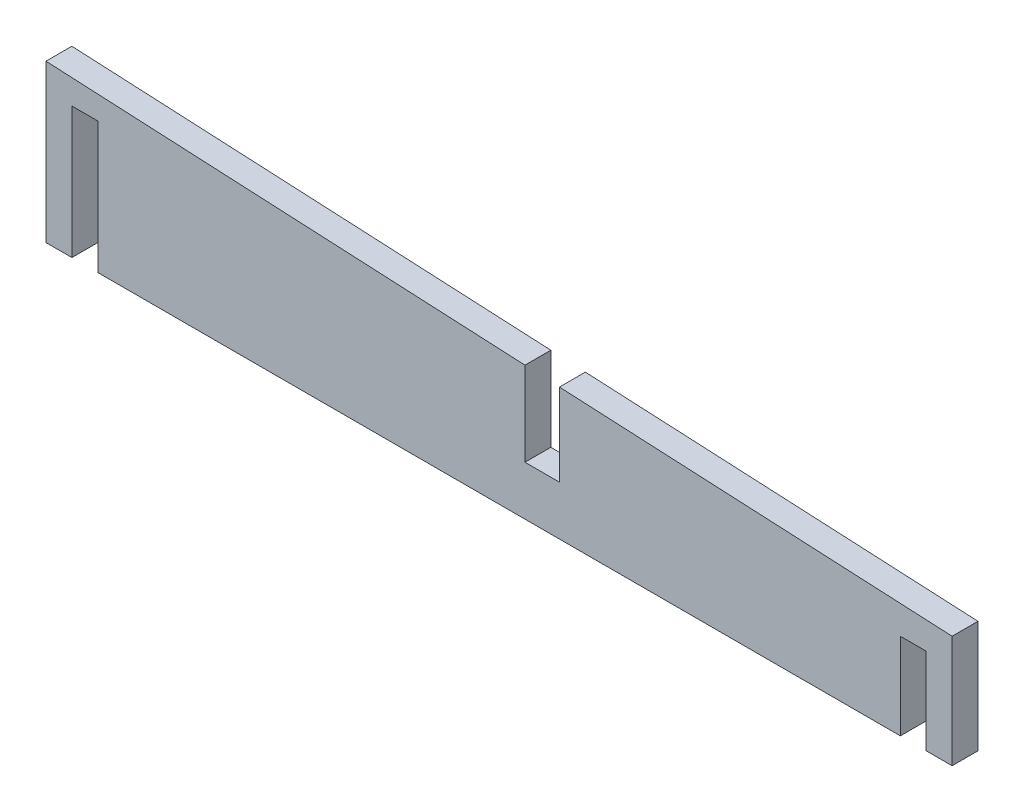
ISO-10303-21;
HEADER;
FILE_DESCRIPTION(('STEP AP214'),'2;1');
FILE_NAME('part.step','',(''),(''),'','','');
FILE_SCHEMA(('AUTOMOTIVE_DESIGN { 1 0 10303 214 1 1 1 1 }'));
ENDSEC;
DATA;
#1=APPLICATION_CONTEXT('core data for automotive mechanical design processes');
#2=APPLICATION_PROTOCOL_DEFINITION('international standard','automotive_design',2000,#1);
#3=PRODUCT_CONTEXT('',#1,'mechanical');
#4=PRODUCT('Part','Part','',(#3));
#5=PRODUCT_RELATED_PRODUCT_CATEGORY('part','',(#4));
#6=PRODUCT_DEFINITION_FORMATION('','',#4);
#7=PRODUCT_DEFINITION_CONTEXT('part definition',#1,'design');
#8=PRODUCT_DEFINITION('design','',#6,#7);
#9=PRODUCT_DEFINITION_SHAPE('','',#8);
#10=(LENGTH_UNIT() NAMED_UNIT(*) SI_UNIT(.MILLI.,.METRE.));
#11=(NAMED_UNIT(*) PLANE_ANGLE_UNIT() SI_UNIT($,.RADIAN.));
#12=(NAMED_UNIT(*) SI_UNIT($,.STERADIAN.) SOLID_ANGLE_UNIT());
#13=UNCERTAINTY_MEASURE_WITH_UNIT(LENGTH_MEASURE(1.E-05),#10,'distance_accuracy_value','');
#14=(GEOMETRIC_REPRESENTATION_CONTEXT(3) GLOBAL_UNCERTAINTY_ASSIGNED_CONTEXT((#13)) GLOBAL_UNIT_ASSIGNED_CONTEXT((#10,
#11,#12)) REPRESENTATION_CONTEXT('',''));
#15=CARTESIAN_POINT('',(0.,0.,0.));
#16=DIRECTION('',(0.,0.,1.));
#17=DIRECTION('',(1.,0.,0.));
#18=AXIS2_PLACEMENT_3D('',#15,#16,#17);
#19=CARTESIAN_POINT('',(99.,0.,3.));
#20=DIRECTION('',(1.,0.,0.));
#21=DIRECTION('',(0.,0.,-1.));
#22=AXIS2_PLACEMENT_3D('',#19,#20,#21);
#23=PLANE('',#22);
#24=DIRECTION('',(0.,-1.,0.));
#25=VECTOR('',#24,1.);
#26=CARTESIAN_POINT('',(99.,0.,0.));
#27=LINE('',#26,#25);
#28=CARTESIAN_POINT('',(99.,9.78991693602012,0.));
#29=VERTEX_POINT('',#28);
#30=CARTESIAN_POINT('',(99.,-0.210083063979876,0.));
#31=VERTEX_POINT('',#30);
#32=EDGE_CURVE('E185',#29,#31,#27,.T.);
#33=ORIENTED_EDGE('',*,*,#32,.T.);
#34=DIRECTION('',(0.,0.,-1.));
#35=VECTOR('',#34,1.);
#36=CARTESIAN_POINT('',(99.,-0.210083063979876,3.));
#37=LINE('',#36,#35);
#38=CARTESIAN_POINT('',(99.,-0.210083063979876,3.));
#39=VERTEX_POINT('',#38);
#40=EDGE_CURVE('E11',#39,#31,#37,.T.);
#41=ORIENTED_EDGE('',*,*,#40,.F.);
#42=DIRECTION('',(0.,-1.,0.));
#43=VECTOR('',#42,1.);
#44=CARTESIAN_POINT('',(99.,0.,3.));
#45=LINE('',#44,#43);
#46=CARTESIAN_POINT('',(99.,9.78991693602012,3.));
#47=VERTEX_POINT('',#46);
#48=EDGE_CURVE('E225',#47,#39,#45,.T.);
#49=ORIENTED_EDGE('',*,*,#48,.F.);
#50=DIRECTION('',(0.,0.,-1.));
#51=VECTOR('',#50,1.);
#52=CARTESIAN_POINT('',(99.,9.78991693602012,3.));
#53=LINE('',#52,#51);
#54=EDGE_CURVE('E57',#47,#29,#53,.T.);
#55=ORIENTED_EDGE('',*,*,#54,.T.);
#56=EDGE_LOOP('',(#33,#41,#49,#55));
#57=FACE_BOUND('',#56,.T.);
#58=ADVANCED_FACE('F41',(#57),#23,.F.);
#59=CARTESIAN_POINT('',(0.,-0.210083063979876,3.));
#60=DIRECTION('',(0.,1.,0.));
#61=DIRECTION('',(0.,0.,1.));
#62=AXIS2_PLACEMENT_3D('',#59,#60,#61);
#63=PLANE('',#62);
#64=DIRECTION('',(1.,0.,0.));
#65=VECTOR('',#64,1.);
#66=CARTESIAN_POINT('',(0.,-0.210083063979876,0.));
#67=LINE('',#66,#65);
#68=CARTESIAN_POINT('',(102.,-0.210083063979876,0.));
#69=VERTEX_POINT('',#68);
#70=EDGE_CURVE('E187',#31,#69,#67,.T.);
#71=ORIENTED_EDGE('',*,*,#70,.T.);
#72=DIRECTION('',(0.,0.,-1.));
#73=VECTOR('',#72,1.);
#74=CARTESIAN_POINT('',(102.,-0.210083063979876,3.));
#75=LINE('',#74,#73);
#76=CARTESIAN_POINT('',(102.,-0.210083063979876,3.));
#77=VERTEX_POINT('',#76);
#78=EDGE_CURVE('E49',#77,#69,#75,.T.);
#79=ORIENTED_EDGE('',*,*,#78,.F.);
#80=DIRECTION('',(1.,0.,0.));
#81=VECTOR('',#80,1.);
#82=CARTESIAN_POINT('',(0.,-0.210083063979876,3.));
#83=LINE('',#82,#81);
#84=EDGE_CURVE('E119',#39,#77,#83,.T.);
#85=ORIENTED_EDGE('',*,*,#84,.F.);
#86=ORIENTED_EDGE('',*,*,#40,.T.);
#87=EDGE_LOOP('',(#71,#79,#85,#86));
#88=FACE_BOUND('',#87,.T.);
#89=ADVANCED_FACE('F307',(#88),#63,.F.);
#90=CARTESIAN_POINT('',(102.,0.,3.));
#91=DIRECTION('',(-1.,0.,0.));
#92=DIRECTION('',(0.,0.,1.));
#93=AXIS2_PLACEMENT_3D('',#90,#91,#92);
#94=PLANE('',#93);
#95=DIRECTION('',(0.,1.,0.));
#96=VECTOR('',#95,1.);
#97=CARTESIAN_POINT('',(102.,0.,0.));
#98=LINE('',#97,#96);
#99=CARTESIAN_POINT('',(102.,12.7899169360201,0.));
#100=VERTEX_POINT('',#99);
#101=EDGE_CURVE('E189',#69,#100,#98,.T.);
#102=ORIENTED_EDGE('',*,*,#101,.T.);
#103=DIRECTION('',(0.,0.,-1.));
#104=VECTOR('',#103,1.);
#105=CARTESIAN_POINT('',(102.,12.7899169360201,3.));
#106=LINE('',#105,#104);
#107=CARTESIAN_POINT('',(102.,12.7899169360201,3.));
#108=VERTEX_POINT('',#107);
#109=EDGE_CURVE('E249',#108,#100,#106,.T.);
#110=ORIENTED_EDGE('',*,*,#109,.F.);
#111=DIRECTION('',(0.,1.,0.));
#112=VECTOR('',#111,1.);
#113=CARTESIAN_POINT('',(102.,0.,3.));
#114=LINE('',#113,#112);
#115=EDGE_CURVE('E257',#77,#108,#114,.T.);
#116=ORIENTED_EDGE('',*,*,#115,.F.);
#117=ORIENTED_EDGE('',*,*,#78,.T.);
#118=EDGE_LOOP('',(#102,#110,#116,#117));
#119=FACE_BOUND('',#118,.T.);
#120=ADVANCED_FACE('F255',(#119),#94,.F.);
#121=CARTESIAN_POINT('',(0.883595186705893,17.8072966332418,3.));
#122=DIRECTION('',(-0.0495588660664779,-0.998771204427823,0.));
#123=DIRECTION('',(0.998771204427824,-0.0495588660664779,0.));
#124=AXIS2_PLACEMENT_3D('',#121,#122,#123);
#125=PLANE('',#124);
#126=DIRECTION('',(-0.998771204427823,0.0495588660664779,0.));
#127=VECTOR('',#126,1.);
#128=CARTESIAN_POINT('',(0.883595186705893,17.8072966332418,0.));
#129=LINE('',#128,#127);
#130=CARTESIAN_POINT('',(56.5,15.0476195970781,0.));
#131=VERTEX_POINT('',#130);
#132=EDGE_CURVE('E191',#100,#131,#129,.T.);
#133=ORIENTED_EDGE('',*,*,#132,.T.);
#134=DIRECTION('',(0.,0.,-1.));
#135=VECTOR('',#134,1.);
#136=CARTESIAN_POINT('',(56.5,15.0476195970781,3.));
#137=LINE('',#136,#135);
#138=CARTESIAN_POINT('',(56.5,15.0476195970781,3.));
#139=VERTEX_POINT('',#138);
#140=EDGE_CURVE('E247',#139,#131,#137,.T.);
#141=ORIENTED_EDGE('',*,*,#140,.F.);
#142=DIRECTION('',(-0.998771204427823,0.0495588660664779,0.));
#143=VECTOR('',#142,1.);
#144=CARTESIAN_POINT('',(0.883595186705893,17.8072966332418,3.));
#145=LINE('',#144,#143);
#146=EDGE_CURVE('E267',#108,#139,#145,.T.);
#147=ORIENTED_EDGE('',*,*,#146,.F.);
#148=ORIENTED_EDGE('',*,*,#109,.T.);
#149=EDGE_LOOP('',(#133,#141,#147,#148));
#150=FACE_BOUND('',#149,.T.);
#151=ADVANCED_FACE('F264',(#150),#125,.F.);
#152=CARTESIAN_POINT('',(56.5,0.,3.));
#153=DIRECTION('',(-1.,0.,0.));
#154=DIRECTION('',(0.,0.,1.));
#155=AXIS2_PLACEMENT_3D('',#152,#153,#154);
#156=PLANE('',#155);
#157=DIRECTION('',(0.,1.,0.));
#158=VECTOR('',#157,1.);
#159=CARTESIAN_POINT('',(56.5,0.,0.));
#160=LINE('',#159,#158);
#161=CARTESIAN_POINT('',(56.5,5.5,0.));
#162=VERTEX_POINT('',#161);
#163=EDGE_CURVE('E194',#162,#131,#160,.T.);
#164=ORIENTED_EDGE('',*,*,#163,.F.);
#165=DIRECTION('',(0.,0.,-1.));
#166=VECTOR('',#165,1.);
#167=CARTESIAN_POINT('',(56.5,5.5,3.));
#168=LINE('',#167,#166);
#169=CARTESIAN_POINT('',(56.5,5.5,3.));
#170=VERTEX_POINT('',#169);
#171=EDGE_CURVE('E245',#170,#162,#168,.T.);
#172=ORIENTED_EDGE('',*,*,#171,.F.);
#173=DIRECTION('',(0.,1.,0.));
#174=VECTOR('',#173,1.);
#175=CARTESIAN_POINT('',(56.5,0.,3.));
#176=LINE('',#175,#174);
#177=EDGE_CURVE('E269',#170,#139,#176,.T.);
#178=ORIENTED_EDGE('',*,*,#177,.T.);
#179=ORIENTED_EDGE('',*,*,#140,.T.);
#180=EDGE_LOOP('',(#164,#172,#178,#179));
#181=FACE_BOUND('',#180,.T.);
#182=ADVANCED_FACE('F320',(#181),#156,.T.);
#183=CARTESIAN_POINT('',(0.,5.49999999999999,3.));
#184=DIRECTION('',(0.,1.,0.));
#185=DIRECTION('',(-1.,0.,0.));
#186=AXIS2_PLACEMENT_3D('',#183,#184,#185);
#187=PLANE('',#186);
#188=DIRECTION('',(1.,0.,0.));
#189=VECTOR('',#188,1.);
#190=CARTESIAN_POINT('',(0.,5.49999999999999,0.));
#191=LINE('',#190,#189);
#192=CARTESIAN_POINT('',(52.5,5.5,0.));
#193=VERTEX_POINT('',#192);
#194=EDGE_CURVE('E197',#193,#162,#191,.T.);
#195=ORIENTED_EDGE('',*,*,#194,.F.);
#196=DIRECTION('',(0.,0.,-1.));
#197=VECTOR('',#196,1.);
#198=CARTESIAN_POINT('',(52.5,5.5,3.));
#199=LINE('',#198,#197);
#200=CARTESIAN_POINT('',(52.5,5.5,3.));
#201=VERTEX_POINT('',#200);
#202=EDGE_CURVE('E243',#201,#193,#199,.T.);
#203=ORIENTED_EDGE('',*,*,#202,.F.);
#204=DIRECTION('',(1.,0.,0.));
#205=VECTOR('',#204,1.);
#206=CARTESIAN_POINT('',(0.,5.49999999999999,3.));
#207=LINE('',#206,#205);
#208=EDGE_CURVE('E271',#201,#170,#207,.T.);
#209=ORIENTED_EDGE('',*,*,#208,.T.);
#210=ORIENTED_EDGE('',*,*,#171,.T.);
#211=EDGE_LOOP('',(#195,#203,#209,#210));
#212=FACE_BOUND('',#211,.T.);
#213=ADVANCED_FACE('F323',(#212),#187,.T.);
#214=CARTESIAN_POINT('',(52.5,0.,3.));
#215=DIRECTION('',(1.,0.,0.));
#216=DIRECTION('',(0.,0.,-1.));
#217=AXIS2_PLACEMENT_3D('',#214,#215,#216);
#218=PLANE('',#217);
#219=DIRECTION('',(0.,-1.,0.));
#220=VECTOR('',#219,1.);
#221=CARTESIAN_POINT('',(52.5,0.,0.));
#222=LINE('',#221,#220);
#223=CARTESIAN_POINT('',(52.5,15.2460989518963,0.));
#224=VERTEX_POINT('',#223);
#225=EDGE_CURVE('E200',#224,#193,#222,.T.);
#226=ORIENTED_EDGE('',*,*,#225,.F.);
#227=DIRECTION('',(0.,0.,-1.));
#228=VECTOR('',#227,1.);
#229=CARTESIAN_POINT('',(52.5,15.2460989518963,3.));
#230=LINE('',#229,#228);
#231=CARTESIAN_POINT('',(52.5,15.2460989518963,3.));
#232=VERTEX_POINT('',#231);
#233=EDGE_CURVE('E241',#232,#224,#230,.T.);
#234=ORIENTED_EDGE('',*,*,#233,.F.);
#235=DIRECTION('',(0.,-1.,0.));
#236=VECTOR('',#235,1.);
#237=CARTESIAN_POINT('',(52.5,0.,3.));
#238=LINE('',#237,#236);
#239=EDGE_CURVE('E278',#232,#201,#238,.T.);
#240=ORIENTED_EDGE('',*,*,#239,.T.);
#241=ORIENTED_EDGE('',*,*,#202,.T.);
#242=EDGE_LOOP('',(#226,#234,#240,#241));
#243=FACE_BOUND('',#242,.T.);
#244=ADVANCED_FACE('F327',(#243),#218,.T.);
#245=CARTESIAN_POINT('',(0.883595186705896,17.8072966332418,3.));
#246=DIRECTION('',(-0.049558866066478,-0.998771204427823,0.));
#247=DIRECTION('',(0.998771204427824,-0.049558866066478,0.));
#248=AXIS2_PLACEMENT_3D('',#245,#246,#247);
#249=PLANE('',#248);
#250=DIRECTION('',(-0.998771204427823,0.049558866066478,0.));
#251=VECTOR('',#250,1.);
#252=CARTESIAN_POINT('',(0.883595186705896,17.8072966332418,0.));
#253=LINE('',#252,#251);
#254=CARTESIAN_POINT('',(-3.,18.,0.));
#255=VERTEX_POINT('',#254);
#256=EDGE_CURVE('E203',#224,#255,#253,.T.);
#257=ORIENTED_EDGE('',*,*,#256,.T.);
#258=DIRECTION('',(0.,0.,-1.));
#259=VECTOR('',#258,1.);
#260=CARTESIAN_POINT('',(-3.,18.,3.));
#261=LINE('',#260,#259);
#262=CARTESIAN_POINT('',(-3.,18.,3.));
#263=VERTEX_POINT('',#262);
#264=EDGE_CURVE('E238',#263,#255,#261,.T.);
#265=ORIENTED_EDGE('',*,*,#264,.F.);
#266=DIRECTION('',(-0.998771204427823,0.049558866066478,0.));
#267=VECTOR('',#266,1.);
#268=CARTESIAN_POINT('',(0.883595186705896,17.8072966332418,3.));
#269=LINE('',#268,#267);
#270=EDGE_CURVE('E281',#232,#263,#269,.T.);
#271=ORIENTED_EDGE('',*,*,#270,.F.);
#272=ORIENTED_EDGE('',*,*,#233,.T.);
#273=EDGE_LOOP('',(#257,#265,#271,#272));
#274=FACE_BOUND('',#273,.T.);
#275=ADVANCED_FACE('F331',(#274),#249,.F.);
#276=CARTESIAN_POINT('',(-3.,0.,3.));
#277=DIRECTION('',(1.,0.,0.));
#278=DIRECTION('',(0.,0.,-1.));
#279=AXIS2_PLACEMENT_3D('',#276,#277,#278);
#280=PLANE('',#279);
#281=DIRECTION('',(0.,-1.,0.));
#282=VECTOR('',#281,1.);
#283=CARTESIAN_POINT('',(-3.,0.,0.));
#284=LINE('',#283,#282);
#285=CARTESIAN_POINT('',(-3.,-0.210083063979877,0.));
#286=VERTEX_POINT('',#285);
#287=EDGE_CURVE('E205',#255,#286,#284,.T.);
#288=ORIENTED_EDGE('',*,*,#287,.T.);
#289=DIRECTION('',(0.,0.,-1.));
#290=VECTOR('',#289,1.);
#291=CARTESIAN_POINT('',(-3.,-0.210083063979877,3.));
#292=LINE('',#291,#290);
#293=CARTESIAN_POINT('',(-3.,-0.210083063979877,3.));
#294=VERTEX_POINT('',#293);
#295=EDGE_CURVE('E235',#294,#286,#292,.T.);
#296=ORIENTED_EDGE('',*,*,#295,.F.);
#297=DIRECTION('',(0.,-1.,0.));
#298=VECTOR('',#297,1.);
#299=CARTESIAN_POINT('',(-3.,0.,3.));
#300=LINE('',#299,#298);
#301=EDGE_CURVE('E283',#263,#294,#300,.T.);
#302=ORIENTED_EDGE('',*,*,#301,.F.);
#303=ORIENTED_EDGE('',*,*,#264,.T.);
#304=EDGE_LOOP('',(#288,#296,#302,#303));
#305=FACE_BOUND('',#304,.T.);
#306=ADVANCED_FACE('F335',(#305),#280,.F.);
#307=CARTESIAN_POINT('',(0.,-0.210083063979876,3.));
#308=DIRECTION('',(0.,1.,0.));
#309=DIRECTION('',(-1.,0.,0.));
#310=AXIS2_PLACEMENT_3D('',#307,#308,#309);
#311=PLANE('',#310);
#312=DIRECTION('',(1.,0.,0.));
#313=VECTOR('',#312,1.);
#314=CARTESIAN_POINT('',(0.,-0.210083063979876,0.));
#315=LINE('',#314,#313);
#316=CARTESIAN_POINT('',(0.,-0.210083063979876,0.));
#317=VERTEX_POINT('',#316);
#318=EDGE_CURVE('E207',#286,#317,#315,.T.);
#319=ORIENTED_EDGE('',*,*,#318,.T.);
#320=DIRECTION('',(0.,0.,-1.));
#321=VECTOR('',#320,1.);
#322=CARTESIAN_POINT('',(0.,-0.210083063979876,3.));
#323=LINE('',#322,#321);
#324=CARTESIAN_POINT('',(0.,-0.210083063979876,3.));
#325=VERTEX_POINT('',#324);
#326=EDGE_CURVE('E233',#325,#317,#323,.T.);
#327=ORIENTED_EDGE('',*,*,#326,.F.);
#328=DIRECTION('',(1.,0.,0.));
#329=VECTOR('',#328,1.);
#330=CARTESIAN_POINT('',(0.,-0.210083063979876,3.));
#331=LINE('',#330,#329);
#332=EDGE_CURVE('E285',#294,#325,#331,.T.);
#333=ORIENTED_EDGE('',*,*,#332,.F.);
#334=ORIENTED_EDGE('',*,*,#295,.T.);
#335=EDGE_LOOP('',(#319,#327,#333,#334));
#336=FACE_BOUND('',#335,.T.);
#337=ADVANCED_FACE('F339',(#336),#311,.F.);
#338=CARTESIAN_POINT('',(0.,0.,3.));
#339=DIRECTION('',(1.,0.,0.));
#340=DIRECTION('',(0.,0.,-1.));
#341=AXIS2_PLACEMENT_3D('',#338,#339,#340);
#342=PLANE('',#341);
#343=DIRECTION('',(0.,-1.,0.));
#344=VECTOR('',#343,1.);
#345=CARTESIAN_POINT('',(0.,0.,0.));
#346=LINE('',#345,#344);
#347=CARTESIAN_POINT('',(0.,15.,0.));
#348=VERTEX_POINT('',#347);
#349=EDGE_CURVE('E210',#348,#317,#346,.T.);
#350=ORIENTED_EDGE('',*,*,#349,.F.);
#351=DIRECTION('',(0.,0.,-1.));
#352=VECTOR('',#351,1.);
#353=CARTESIAN_POINT('',(0.,15.,3.));
#354=LINE('',#353,#352);
#355=CARTESIAN_POINT('',(0.,15.,3.));
#356=VERTEX_POINT('',#355);
#357=EDGE_CURVE('E231',#356,#348,#354,.T.);
#358=ORIENTED_EDGE('',*,*,#357,.F.);
#359=DIRECTION('',(0.,-1.,0.));
#360=VECTOR('',#359,1.);
#361=CARTESIAN_POINT('',(0.,0.,3.));
#362=LINE('',#361,#360);
#363=EDGE_CURVE('E287',#356,#325,#362,.T.);
#364=ORIENTED_EDGE('',*,*,#363,.T.);
#365=ORIENTED_EDGE('',*,*,#326,.T.);
#366=EDGE_LOOP('',(#350,#358,#364,#365));
#367=FACE_BOUND('',#366,.T.);
#368=ADVANCED_FACE('F343',(#367),#342,.T.);
#369=CARTESIAN_POINT('',(0.,15.,3.));
#370=DIRECTION('',(0.,1.,0.));
#371=DIRECTION('',(0.,0.,1.));
#372=AXIS2_PLACEMENT_3D('',#369,#370,#371);
#373=PLANE('',#372);
#374=DIRECTION('',(1.,0.,0.));
#375=VECTOR('',#374,1.);
#376=CARTESIAN_POINT('',(0.,15.,0.));
#377=LINE('',#376,#375);
#378=CARTESIAN_POINT('',(3.,15.,0.));
#379=VERTEX_POINT('',#378);
#380=EDGE_CURVE('E213',#348,#379,#377,.T.);
#381=ORIENTED_EDGE('',*,*,#380,.T.);
#382=DIRECTION('',(0.,0.,-1.));
#383=VECTOR('',#382,1.);
#384=CARTESIAN_POINT('',(3.,15.,3.));
#385=LINE('',#384,#383);
#386=CARTESIAN_POINT('',(3.,15.,3.));
#387=VERTEX_POINT('',#386);
#388=EDGE_CURVE('E229',#387,#379,#385,.T.);
#389=ORIENTED_EDGE('',*,*,#388,.F.);
#390=DIRECTION('',(1.,0.,0.));
#391=VECTOR('',#390,1.);
#392=CARTESIAN_POINT('',(0.,15.,3.));
#393=LINE('',#392,#391);
#394=EDGE_CURVE('E290',#356,#387,#393,.T.);
#395=ORIENTED_EDGE('',*,*,#394,.F.);
#396=ORIENTED_EDGE('',*,*,#357,.T.);
#397=EDGE_LOOP('',(#381,#389,#395,#396));
#398=FACE_BOUND('',#397,.T.);
#399=ADVANCED_FACE('F347',(#398),#373,.F.);
#400=CARTESIAN_POINT('',(3.,0.,3.));
#401=DIRECTION('',(-1.,0.,0.));
#402=DIRECTION('',(0.,0.,1.));
#403=AXIS2_PLACEMENT_3D('',#400,#401,#402);
#404=PLANE('',#403);
#405=DIRECTION('',(0.,1.,0.));
#406=VECTOR('',#405,1.);
#407=CARTESIAN_POINT('',(3.,0.,0.));
#408=LINE('',#407,#406);
#409=CARTESIAN_POINT('',(3.,-0.210083063979876,0.));
#410=VERTEX_POINT('',#409);
#411=EDGE_CURVE('E216',#410,#379,#408,.T.);
#412=ORIENTED_EDGE('',*,*,#411,.F.);
#413=DIRECTION('',(0.,0.,-1.));
#414=VECTOR('',#413,1.);
#415=CARTESIAN_POINT('',(3.,-0.210083063979876,3.));
#416=LINE('',#415,#414);
#417=CARTESIAN_POINT('',(3.,-0.210083063979876,3.));
#418=VERTEX_POINT('',#417);
#419=EDGE_CURVE('E177',#418,#410,#416,.T.);
#420=ORIENTED_EDGE('',*,*,#419,.F.);
#421=DIRECTION('',(0.,1.,0.));
#422=VECTOR('',#421,1.);
#423=CARTESIAN_POINT('',(3.,0.,3.));
#424=LINE('',#423,#422);
#425=EDGE_CURVE('E167',#418,#387,#424,.T.);
#426=ORIENTED_EDGE('',*,*,#425,.T.);
#427=ORIENTED_EDGE('',*,*,#388,.T.);
#428=EDGE_LOOP('',(#412,#420,#426,#427));
#429=FACE_BOUND('',#428,.T.);
#430=ADVANCED_FACE('F293',(#429),#404,.T.);
#431=CARTESIAN_POINT('',(0.,-0.210083063979876,3.));
#432=DIRECTION('',(0.,1.,0.));
#433=DIRECTION('',(0.,0.,1.));
#434=AXIS2_PLACEMENT_3D('',#431,#432,#433);
#435=PLANE('',#434);
#436=DIRECTION('',(1.,0.,0.));
#437=VECTOR('',#436,1.);
#438=CARTESIAN_POINT('',(0.,-0.210083063979876,0.));
#439=LINE('',#438,#437);
#440=CARTESIAN_POINT('',(96.,-0.210083063979876,0.));
#441=VERTEX_POINT('',#440);
#442=EDGE_CURVE('E174',#410,#441,#439,.T.);
#443=ORIENTED_EDGE('',*,*,#442,.T.);
#444=DIRECTION('',(0.,0.,-1.));
#445=VECTOR('',#444,1.);
#446=CARTESIAN_POINT('',(96.,-0.210083063979876,3.));
#447=LINE('',#446,#445);
#448=CARTESIAN_POINT('',(96.,-0.210083063979876,3.));
#449=VERTEX_POINT('',#448);
#450=EDGE_CURVE('E171',#449,#441,#447,.T.);
#451=ORIENTED_EDGE('',*,*,#450,.F.);
#452=DIRECTION('',(1.,0.,0.));
#453=VECTOR('',#452,1.);
#454=CARTESIAN_POINT('',(0.,-0.210083063979876,3.));
#455=LINE('',#454,#453);
#456=EDGE_CURVE('E160',#418,#449,#455,.T.);
#457=ORIENTED_EDGE('',*,*,#456,.F.);
#458=ORIENTED_EDGE('',*,*,#419,.T.);
#459=EDGE_LOOP('',(#443,#451,#457,#458));
#460=FACE_BOUND('',#459,.T.);
#461=ADVANCED_FACE('F172',(#460),#435,.F.);
#462=CARTESIAN_POINT('',(96.,0.,3.));
#463=DIRECTION('',(1.,0.,0.));
#464=DIRECTION('',(0.,0.,-1.));
#465=AXIS2_PLACEMENT_3D('',#462,#463,#464);
#466=PLANE('',#465);
#467=DIRECTION('',(0.,-1.,0.));
#468=VECTOR('',#467,1.);
#469=CARTESIAN_POINT('',(96.,0.,0.));
#470=LINE('',#469,#468);
#471=CARTESIAN_POINT('',(96.,9.78991693602012,0.));
#472=VERTEX_POINT('',#471);
#473=EDGE_CURVE('E220',#472,#441,#470,.T.);
#474=ORIENTED_EDGE('',*,*,#473,.F.);
#475=DIRECTION('',(0.,0.,-1.));
#476=VECTOR('',#475,1.);
#477=CARTESIAN_POINT('',(96.,9.78991693602012,3.));
#478=LINE('',#477,#476);
#479=CARTESIAN_POINT('',(96.,9.78991693602012,3.));
#480=VERTEX_POINT('',#479);
#481=EDGE_CURVE('E107',#480,#472,#478,.T.);
#482=ORIENTED_EDGE('',*,*,#481,.F.);
#483=DIRECTION('',(0.,-1.,0.));
#484=VECTOR('',#483,1.);
#485=CARTESIAN_POINT('',(96.,0.,3.));
#486=LINE('',#485,#484);
#487=EDGE_CURVE('E165',#480,#449,#486,.T.);
#488=ORIENTED_EDGE('',*,*,#487,.T.);
#489=ORIENTED_EDGE('',*,*,#450,.T.);
#490=EDGE_LOOP('',(#474,#482,#488,#489));
#491=FACE_BOUND('',#490,.T.);
#492=ADVANCED_FACE('F179',(#491),#466,.T.);
#493=CARTESIAN_POINT('',(0.,9.78991693602012,3.));
#494=DIRECTION('',(0.,-1.,0.));
#495=DIRECTION('',(0.,0.,-1.));
#496=AXIS2_PLACEMENT_3D('',#493,#494,#495);
#497=PLANE('',#496);
#498=DIRECTION('',(-1.,0.,0.));
#499=VECTOR('',#498,1.);
#500=CARTESIAN_POINT('',(0.,9.78991693602012,0.));
#501=LINE('',#500,#499);
#502=EDGE_CURVE('E222',#29,#472,#501,.T.);
#503=ORIENTED_EDGE('',*,*,#502,.F.);
#504=ORIENTED_EDGE('',*,*,#54,.F.);
#505=DIRECTION('',(-1.,0.,0.));
#506=VECTOR('',#505,1.);
#507=CARTESIAN_POINT('',(0.,9.78991693602012,3.));
#508=LINE('',#507,#506);
#509=EDGE_CURVE('E180',#47,#480,#508,.T.);
#510=ORIENTED_EDGE('',*,*,#509,.T.);
#511=ORIENTED_EDGE('',*,*,#481,.T.);
#512=EDGE_LOOP('',(#503,#504,#510,#511));
#513=FACE_BOUND('',#512,.T.);
#514=ADVANCED_FACE('F296',(#513),#497,.T.);
#515=CARTESIAN_POINT('',(0.,0.,3.));
#516=DIRECTION('',(0.,0.,1.));
#517=DIRECTION('',(1.,0.,0.));
#518=AXIS2_PLACEMENT_3D('',#515,#516,#517);
#519=PLANE('',#518);
#520=ORIENTED_EDGE('',*,*,#48,.T.);
#521=ORIENTED_EDGE('',*,*,#84,.T.);
#522=ORIENTED_EDGE('',*,*,#115,.T.);
#523=ORIENTED_EDGE('',*,*,#146,.T.);
#524=ORIENTED_EDGE('',*,*,#177,.F.);
#525=ORIENTED_EDGE('',*,*,#208,.F.);
#526=ORIENTED_EDGE('',*,*,#239,.F.);
#527=ORIENTED_EDGE('',*,*,#270,.T.);
#528=ORIENTED_EDGE('',*,*,#301,.T.);
#529=ORIENTED_EDGE('',*,*,#332,.T.);
#530=ORIENTED_EDGE('',*,*,#363,.F.);
#531=ORIENTED_EDGE('',*,*,#394,.T.);
#532=ORIENTED_EDGE('',*,*,#425,.F.);
#533=ORIENTED_EDGE('',*,*,#456,.T.);
#534=ORIENTED_EDGE('',*,*,#487,.F.);
#535=ORIENTED_EDGE('',*,*,#509,.F.);
#536=EDGE_LOOP('',(#520,#521,#522,#523,#524,#525,#526,#527,#528,#529,#530,#531,#532,#533,#534,#535));
#537=FACE_BOUND('',#536,.T.);
#538=ADVANCED_FACE('F162',(#537),#519,.T.);
#539=CARTESIAN_POINT('',(0.,0.,0.));
#540=DIRECTION('',(0.,0.,1.));
#541=DIRECTION('',(1.,0.,0.));
#542=AXIS2_PLACEMENT_3D('',#539,#540,#541);
#543=PLANE('',#542);
#544=ORIENTED_EDGE('',*,*,#32,.F.);
#545=ORIENTED_EDGE('',*,*,#502,.T.);
#546=ORIENTED_EDGE('',*,*,#473,.T.);
#547=ORIENTED_EDGE('',*,*,#442,.F.);
#548=ORIENTED_EDGE('',*,*,#411,.T.);
#549=ORIENTED_EDGE('',*,*,#380,.F.);
#550=ORIENTED_EDGE('',*,*,#349,.T.);
#551=ORIENTED_EDGE('',*,*,#318,.F.);
#552=ORIENTED_EDGE('',*,*,#287,.F.);
#553=ORIENTED_EDGE('',*,*,#256,.F.);
#554=ORIENTED_EDGE('',*,*,#225,.T.);
#555=ORIENTED_EDGE('',*,*,#194,.T.);
#556=ORIENTED_EDGE('',*,*,#163,.T.);
#557=ORIENTED_EDGE('',*,*,#132,.F.);
#558=ORIENTED_EDGE('',*,*,#101,.F.);
#559=ORIENTED_EDGE('',*,*,#70,.F.);
#560=EDGE_LOOP('',(#544,#545,#546,#547,#548,#549,#550,#551,#552,#553,#554,#555,#556,#557,#558,#559));
#561=FACE_BOUND('',#560,.T.);
#562=ADVANCED_FACE('F260',(#561),#543,.F.);
#563=CLOSED_SHELL('',(#58,#89,#120,#151,#182,#213,#244,#275,#306,#337,#368,#399,#430,#461,#492,
#514,#538,#562));
#564=MANIFOLD_SOLID_BREP('B2',#563);
#565=ADVANCED_BREP_SHAPE_REPRESENTATION('',(#18,#564),#14);
#566=SHAPE_DEFINITION_REPRESENTATION(#9,#565);
ENDSEC;
END-ISO-10303-21;
